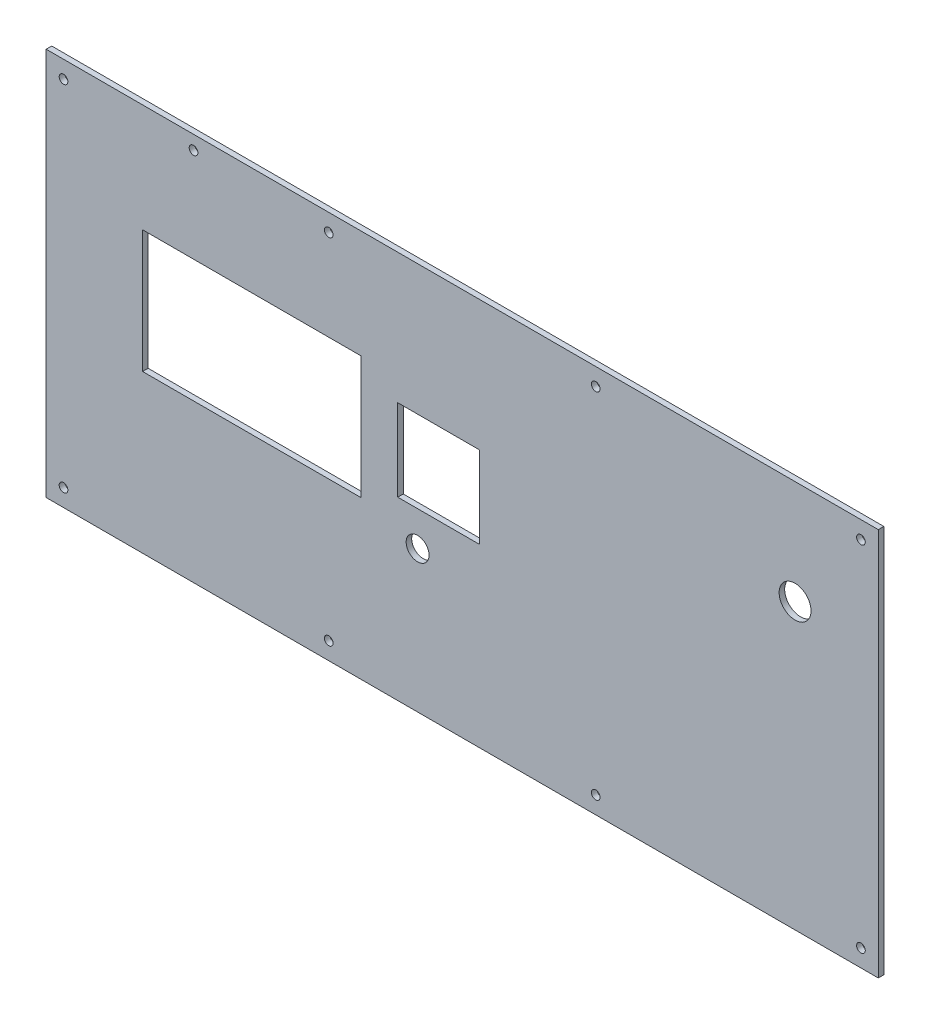
ISO-10303-21;
HEADER;
FILE_DESCRIPTION(('STEP AP214'),'2;1');
FILE_NAME('part.step','',(''),(''),'','','');
FILE_SCHEMA(('AUTOMOTIVE_DESIGN { 1 0 10303 214 1 1 1 1 }'));
ENDSEC;
DATA;
#1=APPLICATION_CONTEXT('core data for automotive mechanical design processes');
#2=APPLICATION_PROTOCOL_DEFINITION('international standard','automotive_design',2000,#1);
#3=PRODUCT_CONTEXT('',#1,'mechanical');
#4=PRODUCT('Part','Part','',(#3));
#5=PRODUCT_RELATED_PRODUCT_CATEGORY('part','',(#4));
#6=PRODUCT_DEFINITION_FORMATION('','',#4);
#7=PRODUCT_DEFINITION_CONTEXT('part definition',#1,'design');
#8=PRODUCT_DEFINITION('design','',#6,#7);
#9=PRODUCT_DEFINITION_SHAPE('','',#8);
#10=(LENGTH_UNIT() NAMED_UNIT(*) SI_UNIT(.MILLI.,.METRE.));
#11=(NAMED_UNIT(*) PLANE_ANGLE_UNIT() SI_UNIT($,.RADIAN.));
#12=(NAMED_UNIT(*) SI_UNIT($,.STERADIAN.) SOLID_ANGLE_UNIT());
#13=UNCERTAINTY_MEASURE_WITH_UNIT(LENGTH_MEASURE(1.E-05),#10,'distance_accuracy_value','');
#14=(GEOMETRIC_REPRESENTATION_CONTEXT(3) GLOBAL_UNCERTAINTY_ASSIGNED_CONTEXT((#13)) GLOBAL_UNIT_ASSIGNED_CONTEXT((#10,
#11,#12)) REPRESENTATION_CONTEXT('',''));
#15=CARTESIAN_POINT('',(0.,0.,0.));
#16=DIRECTION('',(0.,0.,1.));
#17=DIRECTION('',(1.,0.,0.));
#18=AXIS2_PLACEMENT_3D('',#15,#16,#17);
#19=CARTESIAN_POINT('',(-97.155,142.24,2.032));
#20=DIRECTION('',(1.,0.,0.));
#21=DIRECTION('',(0.,1.,0.));
#22=AXIS2_PLACEMENT_3D('',#19,#20,#21);
#23=PLANE('',#22);
#24=DIRECTION('',(0.,-1.,0.));
#25=VECTOR('',#24,1.);
#26=CARTESIAN_POINT('',(-97.155,142.24,0.));
#27=LINE('',#26,#25);
#28=CARTESIAN_POINT('',(-97.155,142.24,0.));
#29=VERTEX_POINT('',#28);
#30=CARTESIAN_POINT('',(-97.155,0.,0.));
#31=VERTEX_POINT('',#30);
#32=EDGE_CURVE('E239',#29,#31,#27,.T.);
#33=ORIENTED_EDGE('',*,*,#32,.T.);
#34=DIRECTION('',(0.,0.,-1.));
#35=VECTOR('',#34,1.);
#36=CARTESIAN_POINT('',(-97.155,0.,2.032));
#37=LINE('',#36,#35);
#38=CARTESIAN_POINT('',(-97.155,0.,2.032));
#39=VERTEX_POINT('',#38);
#40=EDGE_CURVE('E11',#39,#31,#37,.T.);
#41=ORIENTED_EDGE('',*,*,#40,.F.);
#42=DIRECTION('',(0.,-1.,0.));
#43=VECTOR('',#42,1.);
#44=CARTESIAN_POINT('',(-97.155,142.24,2.032));
#45=LINE('',#44,#43);
#46=CARTESIAN_POINT('',(-97.155,142.24,2.032));
#47=VERTEX_POINT('',#46);
#48=EDGE_CURVE('E242',#47,#39,#45,.T.);
#49=ORIENTED_EDGE('',*,*,#48,.F.);
#50=DIRECTION('',(0.,0.,-1.));
#51=VECTOR('',#50,1.);
#52=CARTESIAN_POINT('',(-97.155,142.24,2.032));
#53=LINE('',#52,#51);
#54=EDGE_CURVE('E252',#47,#29,#53,.T.);
#55=ORIENTED_EDGE('',*,*,#54,.T.);
#56=EDGE_LOOP('',(#33,#41,#49,#55));
#57=FACE_BOUND('',#56,.T.);
#58=ADVANCED_FACE('F33',(#57),#23,.F.);
#59=CARTESIAN_POINT('',(-97.155,0.,2.032));
#60=DIRECTION('',(0.,1.,0.));
#61=DIRECTION('',(0.,0.,1.));
#62=AXIS2_PLACEMENT_3D('',#59,#60,#61);
#63=PLANE('',#62);
#64=DIRECTION('',(1.,0.,0.));
#65=VECTOR('',#64,1.);
#66=CARTESIAN_POINT('',(-97.155,0.,0.));
#67=LINE('',#66,#65);
#68=CARTESIAN_POINT('',(207.645,0.,0.));
#69=VERTEX_POINT('',#68);
#70=EDGE_CURVE('E255',#31,#69,#67,.T.);
#71=ORIENTED_EDGE('',*,*,#70,.T.);
#72=DIRECTION('',(0.,0.,-1.));
#73=VECTOR('',#72,1.);
#74=CARTESIAN_POINT('',(207.645,0.,2.032));
#75=LINE('',#74,#73);
#76=CARTESIAN_POINT('',(207.645,0.,2.032));
#77=VERTEX_POINT('',#76);
#78=EDGE_CURVE('E40',#77,#69,#75,.T.);
#79=ORIENTED_EDGE('',*,*,#78,.F.);
#80=DIRECTION('',(1.,0.,0.));
#81=VECTOR('',#80,1.);
#82=CARTESIAN_POINT('',(-97.155,0.,2.032));
#83=LINE('',#82,#81);
#84=EDGE_CURVE('E245',#39,#77,#83,.T.);
#85=ORIENTED_EDGE('',*,*,#84,.F.);
#86=ORIENTED_EDGE('',*,*,#40,.T.);
#87=EDGE_LOOP('',(#71,#79,#85,#86));
#88=FACE_BOUND('',#87,.T.);
#89=ADVANCED_FACE('F284',(#88),#63,.F.);
#90=CARTESIAN_POINT('',(207.645,142.24,2.032));
#91=DIRECTION('',(-1.,0.,0.));
#92=DIRECTION('',(0.,-1.,0.));
#93=AXIS2_PLACEMENT_3D('',#90,#91,#92);
#94=PLANE('',#93);
#95=DIRECTION('',(0.,1.,0.));
#96=VECTOR('',#95,1.);
#97=CARTESIAN_POINT('',(207.645,142.24,0.));
#98=LINE('',#97,#96);
#99=CARTESIAN_POINT('',(207.645,142.24,0.));
#100=VERTEX_POINT('',#99);
#101=EDGE_CURVE('E257',#69,#100,#98,.T.);
#102=ORIENTED_EDGE('',*,*,#101,.T.);
#103=DIRECTION('',(0.,0.,-1.));
#104=VECTOR('',#103,1.);
#105=CARTESIAN_POINT('',(207.645,142.24,2.032));
#106=LINE('',#105,#104);
#107=CARTESIAN_POINT('',(207.645,142.24,2.032));
#108=VERTEX_POINT('',#107);
#109=EDGE_CURVE('E262',#108,#100,#106,.T.);
#110=ORIENTED_EDGE('',*,*,#109,.F.);
#111=DIRECTION('',(0.,1.,0.));
#112=VECTOR('',#111,1.);
#113=CARTESIAN_POINT('',(207.645,142.24,2.032));
#114=LINE('',#113,#112);
#115=EDGE_CURVE('E248',#77,#108,#114,.T.);
#116=ORIENTED_EDGE('',*,*,#115,.F.);
#117=ORIENTED_EDGE('',*,*,#78,.T.);
#118=EDGE_LOOP('',(#102,#110,#116,#117));
#119=FACE_BOUND('',#118,.T.);
#120=ADVANCED_FACE('F269',(#119),#94,.F.);
#121=CARTESIAN_POINT('',(-97.155,142.24,2.032));
#122=DIRECTION('',(0.,-1.,0.));
#123=DIRECTION('',(0.,0.,-1.));
#124=AXIS2_PLACEMENT_3D('',#121,#122,#123);
#125=PLANE('',#124);
#126=DIRECTION('',(-1.,0.,0.));
#127=VECTOR('',#126,1.);
#128=CARTESIAN_POINT('',(-97.155,142.24,0.));
#129=LINE('',#128,#127);
#130=EDGE_CURVE('E246',#100,#29,#129,.T.);
#131=ORIENTED_EDGE('',*,*,#130,.T.);
#132=ORIENTED_EDGE('',*,*,#54,.F.);
#133=DIRECTION('',(-1.,0.,0.));
#134=VECTOR('',#133,1.);
#135=CARTESIAN_POINT('',(-97.155,142.24,2.032));
#136=LINE('',#135,#134);
#137=EDGE_CURVE('E250',#108,#47,#136,.T.);
#138=ORIENTED_EDGE('',*,*,#137,.F.);
#139=ORIENTED_EDGE('',*,*,#109,.T.);
#140=EDGE_LOOP('',(#131,#132,#138,#139));
#141=FACE_BOUND('',#140,.T.);
#142=ADVANCED_FACE('F277',(#141),#125,.F.);
#143=CARTESIAN_POINT('',(-97.155,0.,2.032));
#144=DIRECTION('',(0.,0.,1.));
#145=DIRECTION('',(1.,0.,0.));
#146=AXIS2_PLACEMENT_3D('',#143,#144,#145);
#147=PLANE('',#146);
#148=CARTESIAN_POINT('',(177.165,104.14,2.032));
#149=DIRECTION('',(0.,0.,1.));
#150=DIRECTION('',(1.,0.,0.));
#151=AXIS2_PLACEMENT_3D('',#148,#149,#150);
#152=CIRCLE('',#151,5.84199999999999);
#153=CARTESIAN_POINT('',(183.007,104.14,2.032));
#154=VERTEX_POINT('',#153);
#155=EDGE_CURVE('E378',#154,#154,#152,.T.);
#156=ORIENTED_EDGE('',*,*,#155,.F.);
#157=EDGE_LOOP('',(#156));
#158=FACE_BOUND('',#157,.T.);
#159=CARTESIAN_POINT('',(38.895,51.84,2.032));
#160=DIRECTION('',(0.,0.,1.));
#161=DIRECTION('',(1.,0.,0.));
#162=AXIS2_PLACEMENT_3D('',#159,#160,#161);
#163=CIRCLE('',#162,4.191);
#164=CARTESIAN_POINT('',(43.086,51.84,2.032));
#165=VERTEX_POINT('',#164);
#166=EDGE_CURVE('E380',#165,#165,#163,.T.);
#167=ORIENTED_EDGE('',*,*,#166,.F.);
#168=EDGE_LOOP('',(#167));
#169=FACE_BOUND('',#168,.T.);
#170=CARTESIAN_POINT('',(-43.18,137.16,2.032));
#171=DIRECTION('',(0.,0.,1.));
#172=DIRECTION('',(1.,0.,0.));
#173=AXIS2_PLACEMENT_3D('',#170,#171,#172);
#174=CIRCLE('',#173,1.5875);
#175=CARTESIAN_POINT('',(-41.5925,137.16,2.032));
#176=VERTEX_POINT('',#175);
#177=EDGE_CURVE('E145',#176,#176,#174,.T.);
#178=ORIENTED_EDGE('',*,*,#177,.F.);
#179=EDGE_LOOP('',(#178));
#180=FACE_BOUND('',#179,.T.);
#181=DIRECTION('',(0.,-1.,0.));
#182=VECTOR('',#181,1.);
#183=CARTESIAN_POINT('',(-61.849,102.616,2.032));
#184=LINE('',#183,#182);
#185=CARTESIAN_POINT('',(-61.849,102.616,2.032));
#186=VERTEX_POINT('',#185);
#187=CARTESIAN_POINT('',(-61.849,57.658,2.032));
#188=VERTEX_POINT('',#187);
#189=EDGE_CURVE('E47',#186,#188,#184,.T.);
#190=ORIENTED_EDGE('',*,*,#189,.F.);
#191=DIRECTION('',(-1.,0.,0.));
#192=VECTOR('',#191,1.);
#193=CARTESIAN_POINT('',(-61.849,102.616,2.032));
#194=LINE('',#193,#192);
#195=CARTESIAN_POINT('',(18.1609999999999,102.616,2.032));
#196=VERTEX_POINT('',#195);
#197=EDGE_CURVE('E139',#196,#186,#194,.T.);
#198=ORIENTED_EDGE('',*,*,#197,.F.);
#199=DIRECTION('',(0.,1.,0.));
#200=VECTOR('',#199,1.);
#201=CARTESIAN_POINT('',(18.1609999999999,102.616,2.032));
#202=LINE('',#201,#200);
#203=CARTESIAN_POINT('',(18.1609999999999,57.658,2.032));
#204=VERTEX_POINT('',#203);
#205=EDGE_CURVE('E142',#204,#196,#202,.T.);
#206=ORIENTED_EDGE('',*,*,#205,.F.);
#207=DIRECTION('',(1.,0.,0.));
#208=VECTOR('',#207,1.);
#209=CARTESIAN_POINT('',(-61.849,57.658,2.032));
#210=LINE('',#209,#208);
#211=EDGE_CURVE('E151',#188,#204,#210,.T.);
#212=ORIENTED_EDGE('',*,*,#211,.F.);
#213=EDGE_LOOP('',(#190,#198,#206,#212));
#214=FACE_BOUND('',#213,.T.);
#215=DIRECTION('',(0.,-1.,0.));
#216=VECTOR('',#215,1.);
#217=CARTESIAN_POINT('',(31.623,64.516,2.032));
#218=LINE('',#217,#216);
#219=CARTESIAN_POINT('',(31.623,94.488,2.032));
#220=VERTEX_POINT('',#219);
#221=CARTESIAN_POINT('',(31.623,64.516,2.032));
#222=VERTEX_POINT('',#221);
#223=EDGE_CURVE('E158',#220,#222,#218,.T.);
#224=ORIENTED_EDGE('',*,*,#223,.F.);
#225=DIRECTION('',(-1.,0.,0.));
#226=VECTOR('',#225,1.);
#227=CARTESIAN_POINT('',(31.623,94.488,2.032));
#228=LINE('',#227,#226);
#229=CARTESIAN_POINT('',(61.5949999999999,94.488,2.032));
#230=VERTEX_POINT('',#229);
#231=EDGE_CURVE('E166',#230,#220,#228,.T.);
#232=ORIENTED_EDGE('',*,*,#231,.F.);
#233=DIRECTION('',(0.,1.,0.));
#234=VECTOR('',#233,1.);
#235=CARTESIAN_POINT('',(61.595,64.516,2.032));
#236=LINE('',#235,#234);
#237=CARTESIAN_POINT('',(61.595,64.516,2.032));
#238=VERTEX_POINT('',#237);
#239=EDGE_CURVE('E180',#238,#230,#236,.T.);
#240=ORIENTED_EDGE('',*,*,#239,.F.);
#241=DIRECTION('',(1.,0.,0.));
#242=VECTOR('',#241,1.);
#243=CARTESIAN_POINT('',(31.623,64.516,2.032));
#244=LINE('',#243,#242);
#245=EDGE_CURVE('E177',#222,#238,#244,.T.);
#246=ORIENTED_EDGE('',*,*,#245,.F.);
#247=EDGE_LOOP('',(#224,#232,#240,#246));
#248=FACE_BOUND('',#247,.T.);
#249=CARTESIAN_POINT('',(201.295,135.89,2.032));
#250=DIRECTION('',(0.,0.,1.));
#251=DIRECTION('',(-1.,0.,0.));
#252=AXIS2_PLACEMENT_3D('',#249,#250,#251);
#253=CIRCLE('',#252,1.58750000000001);
#254=CARTESIAN_POINT('',(199.7075,135.89,2.032));
#255=VERTEX_POINT('',#254);
#256=EDGE_CURVE('E187',#255,#255,#253,.T.);
#257=ORIENTED_EDGE('',*,*,#256,.F.);
#258=EDGE_LOOP('',(#257));
#259=FACE_BOUND('',#258,.T.);
#260=CARTESIAN_POINT('',(201.295,6.35,2.032));
#261=DIRECTION('',(0.,0.,1.));
#262=DIRECTION('',(-1.,0.,0.));
#263=AXIS2_PLACEMENT_3D('',#260,#261,#262);
#264=CIRCLE('',#263,1.58750000000001);
#265=CARTESIAN_POINT('',(199.7075,6.35,2.032));
#266=VERTEX_POINT('',#265);
#267=EDGE_CURVE('E197',#266,#266,#264,.T.);
#268=ORIENTED_EDGE('',*,*,#267,.F.);
#269=EDGE_LOOP('',(#268));
#270=FACE_BOUND('',#269,.T.);
#271=CARTESIAN_POINT('',(104.14,135.89,2.032));
#272=DIRECTION('',(0.,0.,1.));
#273=DIRECTION('',(-1.,0.,0.));
#274=AXIS2_PLACEMENT_3D('',#271,#272,#273);
#275=CIRCLE('',#274,1.58749999999999);
#276=CARTESIAN_POINT('',(102.5525,135.89,2.032));
#277=VERTEX_POINT('',#276);
#278=EDGE_CURVE('E203',#277,#277,#275,.T.);
#279=ORIENTED_EDGE('',*,*,#278,.F.);
#280=EDGE_LOOP('',(#279));
#281=FACE_BOUND('',#280,.T.);
#282=CARTESIAN_POINT('',(104.14,6.34999999999882,2.032));
#283=DIRECTION('',(0.,0.,1.));
#284=DIRECTION('',(-1.,0.,0.));
#285=AXIS2_PLACEMENT_3D('',#282,#283,#284);
#286=CIRCLE('',#285,1.5875);
#287=CARTESIAN_POINT('',(102.5525,6.34999999999882,2.032));
#288=VERTEX_POINT('',#287);
#289=EDGE_CURVE('E209',#288,#288,#286,.T.);
#290=ORIENTED_EDGE('',*,*,#289,.F.);
#291=EDGE_LOOP('',(#290));
#292=FACE_BOUND('',#291,.T.);
#293=CARTESIAN_POINT('',(6.35,6.34999999999882,2.032));
#294=DIRECTION('',(0.,0.,1.));
#295=DIRECTION('',(1.,0.,0.));
#296=AXIS2_PLACEMENT_3D('',#293,#294,#295);
#297=CIRCLE('',#296,1.5875);
#298=CARTESIAN_POINT('',(7.9375,6.34999999999882,2.032));
#299=VERTEX_POINT('',#298);
#300=EDGE_CURVE('E215',#299,#299,#297,.T.);
#301=ORIENTED_EDGE('',*,*,#300,.F.);
#302=EDGE_LOOP('',(#301));
#303=FACE_BOUND('',#302,.T.);
#304=CARTESIAN_POINT('',(6.34999999999999,135.89,2.032));
#305=DIRECTION('',(0.,0.,1.));
#306=DIRECTION('',(1.,0.,0.));
#307=AXIS2_PLACEMENT_3D('',#304,#305,#306);
#308=CIRCLE('',#307,1.5875);
#309=CARTESIAN_POINT('',(7.93749999999999,135.89,2.032));
#310=VERTEX_POINT('',#309);
#311=EDGE_CURVE('E221',#310,#310,#308,.T.);
#312=ORIENTED_EDGE('',*,*,#311,.F.);
#313=EDGE_LOOP('',(#312));
#314=FACE_BOUND('',#313,.T.);
#315=CARTESIAN_POINT('',(-90.805,6.35,2.032));
#316=DIRECTION('',(0.,0.,1.));
#317=DIRECTION('',(1.,0.,0.));
#318=AXIS2_PLACEMENT_3D('',#315,#316,#317);
#319=CIRCLE('',#318,1.5875);
#320=CARTESIAN_POINT('',(-89.2175,6.35,2.032));
#321=VERTEX_POINT('',#320);
#322=EDGE_CURVE('E227',#321,#321,#319,.T.);
#323=ORIENTED_EDGE('',*,*,#322,.F.);
#324=EDGE_LOOP('',(#323));
#325=FACE_BOUND('',#324,.T.);
#326=CARTESIAN_POINT('',(-90.805,135.89,2.032));
#327=DIRECTION('',(0.,0.,1.));
#328=DIRECTION('',(1.,0.,0.));
#329=AXIS2_PLACEMENT_3D('',#326,#327,#328);
#330=CIRCLE('',#329,1.58749999999999);
#331=CARTESIAN_POINT('',(-89.2175000000001,135.89,2.032));
#332=VERTEX_POINT('',#331);
#333=EDGE_CURVE('E233',#332,#332,#330,.T.);
#334=ORIENTED_EDGE('',*,*,#333,.F.);
#335=EDGE_LOOP('',(#334));
#336=FACE_BOUND('',#335,.T.);
#337=ORIENTED_EDGE('',*,*,#48,.T.);
#338=ORIENTED_EDGE('',*,*,#84,.T.);
#339=ORIENTED_EDGE('',*,*,#115,.T.);
#340=ORIENTED_EDGE('',*,*,#137,.T.);
#341=EDGE_LOOP('',(#337,#338,#339,#340));
#342=FACE_BOUND('',#341,.T.);
#343=ADVANCED_FACE('F283',(#158,#169,#180,#214,#248,#259,#270,#281,#292,#303,#314,#325,#336,
#342),#147,.T.);
#344=CARTESIAN_POINT('',(-97.155,0.,0.));
#345=DIRECTION('',(0.,0.,1.));
#346=DIRECTION('',(1.,0.,0.));
#347=AXIS2_PLACEMENT_3D('',#344,#345,#346);
#348=PLANE('',#347);
#349=CARTESIAN_POINT('',(177.165,104.14,0.));
#350=DIRECTION('',(0.,0.,1.));
#351=DIRECTION('',(1.,0.,0.));
#352=AXIS2_PLACEMENT_3D('',#349,#350,#351);
#353=CIRCLE('',#352,5.84199999999999);
#354=CARTESIAN_POINT('',(183.007,104.14,0.));
#355=VERTEX_POINT('',#354);
#356=EDGE_CURVE('E375',#355,#355,#353,.T.);
#357=ORIENTED_EDGE('',*,*,#356,.T.);
#358=EDGE_LOOP('',(#357));
#359=FACE_BOUND('',#358,.T.);
#360=CARTESIAN_POINT('',(38.895,51.84,0.));
#361=DIRECTION('',(0.,0.,1.));
#362=DIRECTION('',(1.,0.,0.));
#363=AXIS2_PLACEMENT_3D('',#360,#361,#362);
#364=CIRCLE('',#363,4.191);
#365=CARTESIAN_POINT('',(43.086,51.84,0.));
#366=VERTEX_POINT('',#365);
#367=EDGE_CURVE('E383',#366,#366,#364,.T.);
#368=ORIENTED_EDGE('',*,*,#367,.T.);
#369=EDGE_LOOP('',(#368));
#370=FACE_BOUND('',#369,.T.);
#371=CARTESIAN_POINT('',(-43.18,137.16,0.));
#372=DIRECTION('',(0.,0.,1.));
#373=DIRECTION('',(1.,0.,0.));
#374=AXIS2_PLACEMENT_3D('',#371,#372,#373);
#375=CIRCLE('',#374,1.5875);
#376=CARTESIAN_POINT('',(-41.5925,137.16,0.));
#377=VERTEX_POINT('',#376);
#378=EDGE_CURVE('E152',#377,#377,#375,.T.);
#379=ORIENTED_EDGE('',*,*,#378,.T.);
#380=EDGE_LOOP('',(#379));
#381=FACE_BOUND('',#380,.T.);
#382=DIRECTION('',(-1.,0.,0.));
#383=VECTOR('',#382,1.);
#384=CARTESIAN_POINT('',(-61.849,102.616,0.));
#385=LINE('',#384,#383);
#386=CARTESIAN_POINT('',(18.1609999999999,102.616,0.));
#387=VERTEX_POINT('',#386);
#388=CARTESIAN_POINT('',(-61.849,102.616,0.));
#389=VERTEX_POINT('',#388);
#390=EDGE_CURVE('E129',#387,#389,#385,.T.);
#391=ORIENTED_EDGE('',*,*,#390,.T.);
#392=DIRECTION('',(0.,-1.,0.));
#393=VECTOR('',#392,1.);
#394=CARTESIAN_POINT('',(-61.849,102.616,0.));
#395=LINE('',#394,#393);
#396=CARTESIAN_POINT('',(-61.849,57.658,0.));
#397=VERTEX_POINT('',#396);
#398=EDGE_CURVE('E123',#389,#397,#395,.T.);
#399=ORIENTED_EDGE('',*,*,#398,.T.);
#400=DIRECTION('',(1.,0.,0.));
#401=VECTOR('',#400,1.);
#402=CARTESIAN_POINT('',(-61.849,57.658,0.));
#403=LINE('',#402,#401);
#404=CARTESIAN_POINT('',(18.1609999999999,57.658,0.));
#405=VERTEX_POINT('',#404);
#406=EDGE_CURVE('E132',#397,#405,#403,.T.);
#407=ORIENTED_EDGE('',*,*,#406,.T.);
#408=DIRECTION('',(0.,1.,0.));
#409=VECTOR('',#408,1.);
#410=CARTESIAN_POINT('',(18.1609999999999,102.616,0.));
#411=LINE('',#410,#409);
#412=EDGE_CURVE('E55',#405,#387,#411,.T.);
#413=ORIENTED_EDGE('',*,*,#412,.T.);
#414=EDGE_LOOP('',(#391,#399,#407,#413));
#415=FACE_BOUND('',#414,.T.);
#416=DIRECTION('',(-1.,0.,0.));
#417=VECTOR('',#416,1.);
#418=CARTESIAN_POINT('',(31.623,94.488,0.));
#419=LINE('',#418,#417);
#420=CARTESIAN_POINT('',(61.5949999999999,94.488,0.));
#421=VERTEX_POINT('',#420);
#422=CARTESIAN_POINT('',(31.623,94.488,0.));
#423=VERTEX_POINT('',#422);
#424=EDGE_CURVE('E172',#421,#423,#419,.T.);
#425=ORIENTED_EDGE('',*,*,#424,.T.);
#426=DIRECTION('',(0.,-1.,0.));
#427=VECTOR('',#426,1.);
#428=CARTESIAN_POINT('',(31.623,64.516,0.));
#429=LINE('',#428,#427);
#430=CARTESIAN_POINT('',(31.623,64.516,0.));
#431=VERTEX_POINT('',#430);
#432=EDGE_CURVE('E162',#423,#431,#429,.T.);
#433=ORIENTED_EDGE('',*,*,#432,.T.);
#434=DIRECTION('',(1.,0.,0.));
#435=VECTOR('',#434,1.);
#436=CARTESIAN_POINT('',(31.623,64.516,0.));
#437=LINE('',#436,#435);
#438=CARTESIAN_POINT('',(61.5949999999999,64.516,0.));
#439=VERTEX_POINT('',#438);
#440=EDGE_CURVE('E165',#431,#439,#437,.T.);
#441=ORIENTED_EDGE('',*,*,#440,.T.);
#442=DIRECTION('',(0.,1.,0.));
#443=VECTOR('',#442,1.);
#444=CARTESIAN_POINT('',(61.595,64.516,0.));
#445=LINE('',#444,#443);
#446=EDGE_CURVE('E169',#439,#421,#445,.T.);
#447=ORIENTED_EDGE('',*,*,#446,.T.);
#448=EDGE_LOOP('',(#425,#433,#441,#447));
#449=FACE_BOUND('',#448,.T.);
#450=CARTESIAN_POINT('',(201.295,135.89,0.));
#451=DIRECTION('',(0.,0.,1.));
#452=DIRECTION('',(-1.,0.,0.));
#453=AXIS2_PLACEMENT_3D('',#450,#451,#452);
#454=CIRCLE('',#453,1.58750000000001);
#455=CARTESIAN_POINT('',(199.7075,135.89,0.));
#456=VERTEX_POINT('',#455);
#457=EDGE_CURVE('E194',#456,#456,#454,.T.);
#458=ORIENTED_EDGE('',*,*,#457,.T.);
#459=EDGE_LOOP('',(#458));
#460=FACE_BOUND('',#459,.T.);
#461=CARTESIAN_POINT('',(201.295,6.35,0.));
#462=DIRECTION('',(0.,0.,1.));
#463=DIRECTION('',(-1.,0.,0.));
#464=AXIS2_PLACEMENT_3D('',#461,#462,#463);
#465=CIRCLE('',#464,1.58750000000001);
#466=CARTESIAN_POINT('',(199.7075,6.35,0.));
#467=VERTEX_POINT('',#466);
#468=EDGE_CURVE('E200',#467,#467,#465,.T.);
#469=ORIENTED_EDGE('',*,*,#468,.T.);
#470=EDGE_LOOP('',(#469));
#471=FACE_BOUND('',#470,.T.);
#472=CARTESIAN_POINT('',(104.14,135.89,0.));
#473=DIRECTION('',(0.,0.,1.));
#474=DIRECTION('',(-1.,0.,0.));
#475=AXIS2_PLACEMENT_3D('',#472,#473,#474);
#476=CIRCLE('',#475,1.58749999999999);
#477=CARTESIAN_POINT('',(102.5525,135.89,0.));
#478=VERTEX_POINT('',#477);
#479=EDGE_CURVE('E206',#478,#478,#476,.T.);
#480=ORIENTED_EDGE('',*,*,#479,.T.);
#481=EDGE_LOOP('',(#480));
#482=FACE_BOUND('',#481,.T.);
#483=CARTESIAN_POINT('',(104.14,6.34999999999882,0.));
#484=DIRECTION('',(0.,0.,1.));
#485=DIRECTION('',(-1.,0.,0.));
#486=AXIS2_PLACEMENT_3D('',#483,#484,#485);
#487=CIRCLE('',#486,1.5875);
#488=CARTESIAN_POINT('',(102.5525,6.34999999999882,0.));
#489=VERTEX_POINT('',#488);
#490=EDGE_CURVE('E212',#489,#489,#487,.T.);
#491=ORIENTED_EDGE('',*,*,#490,.T.);
#492=EDGE_LOOP('',(#491));
#493=FACE_BOUND('',#492,.T.);
#494=CARTESIAN_POINT('',(6.35,6.34999999999882,0.));
#495=DIRECTION('',(0.,0.,1.));
#496=DIRECTION('',(1.,0.,0.));
#497=AXIS2_PLACEMENT_3D('',#494,#495,#496);
#498=CIRCLE('',#497,1.5875);
#499=CARTESIAN_POINT('',(7.9375,6.34999999999882,0.));
#500=VERTEX_POINT('',#499);
#501=EDGE_CURVE('E218',#500,#500,#498,.T.);
#502=ORIENTED_EDGE('',*,*,#501,.T.);
#503=EDGE_LOOP('',(#502));
#504=FACE_BOUND('',#503,.T.);
#505=CARTESIAN_POINT('',(6.34999999999999,135.89,0.));
#506=DIRECTION('',(0.,0.,1.));
#507=DIRECTION('',(1.,0.,0.));
#508=AXIS2_PLACEMENT_3D('',#505,#506,#507);
#509=CIRCLE('',#508,1.5875);
#510=CARTESIAN_POINT('',(7.93749999999999,135.89,0.));
#511=VERTEX_POINT('',#510);
#512=EDGE_CURVE('E224',#511,#511,#509,.T.);
#513=ORIENTED_EDGE('',*,*,#512,.T.);
#514=EDGE_LOOP('',(#513));
#515=FACE_BOUND('',#514,.T.);
#516=CARTESIAN_POINT('',(-90.805,6.35,0.));
#517=DIRECTION('',(0.,0.,1.));
#518=DIRECTION('',(1.,0.,0.));
#519=AXIS2_PLACEMENT_3D('',#516,#517,#518);
#520=CIRCLE('',#519,1.5875);
#521=CARTESIAN_POINT('',(-89.2175,6.35,0.));
#522=VERTEX_POINT('',#521);
#523=EDGE_CURVE('E230',#522,#522,#520,.T.);
#524=ORIENTED_EDGE('',*,*,#523,.T.);
#525=EDGE_LOOP('',(#524));
#526=FACE_BOUND('',#525,.T.);
#527=CARTESIAN_POINT('',(-90.805,135.89,0.));
#528=DIRECTION('',(0.,0.,1.));
#529=DIRECTION('',(1.,0.,0.));
#530=AXIS2_PLACEMENT_3D('',#527,#528,#529);
#531=CIRCLE('',#530,1.58749999999999);
#532=CARTESIAN_POINT('',(-89.2175000000001,135.89,0.));
#533=VERTEX_POINT('',#532);
#534=EDGE_CURVE('E236',#533,#533,#531,.T.);
#535=ORIENTED_EDGE('',*,*,#534,.T.);
#536=EDGE_LOOP('',(#535));
#537=FACE_BOUND('',#536,.T.);
#538=ORIENTED_EDGE('',*,*,#32,.F.);
#539=ORIENTED_EDGE('',*,*,#130,.F.);
#540=ORIENTED_EDGE('',*,*,#101,.F.);
#541=ORIENTED_EDGE('',*,*,#70,.F.);
#542=EDGE_LOOP('',(#538,#539,#540,#541));
#543=FACE_BOUND('',#542,.T.);
#544=ADVANCED_FACE('F136',(#359,#370,#381,#415,#449,#460,#471,#482,#493,#504,#515,#526,#537,
#543),#348,.F.);
#545=CARTESIAN_POINT('',(-90.805,135.89,0.));
#546=DIRECTION('',(0.,0.,1.));
#547=DIRECTION('',(1.,0.,0.));
#548=AXIS2_PLACEMENT_3D('',#545,#546,#547);
#549=CYLINDRICAL_SURFACE('',#548,1.58749999999999);
#550=ORIENTED_EDGE('',*,*,#534,.F.);
#551=EDGE_LOOP('',(#550));
#552=FACE_BOUND('',#551,.T.);
#553=ORIENTED_EDGE('',*,*,#333,.T.);
#554=EDGE_LOOP('',(#553));
#555=FACE_BOUND('',#554,.T.);
#556=ADVANCED_FACE('F296',(#552,#555),#549,.F.);
#557=CARTESIAN_POINT('',(-90.805,6.35,0.));
#558=DIRECTION('',(0.,0.,1.));
#559=DIRECTION('',(1.,0.,0.));
#560=AXIS2_PLACEMENT_3D('',#557,#558,#559);
#561=CYLINDRICAL_SURFACE('',#560,1.5875);
#562=ORIENTED_EDGE('',*,*,#523,.F.);
#563=EDGE_LOOP('',(#562));
#564=FACE_BOUND('',#563,.T.);
#565=ORIENTED_EDGE('',*,*,#322,.T.);
#566=EDGE_LOOP('',(#565));
#567=FACE_BOUND('',#566,.T.);
#568=ADVANCED_FACE('F303',(#564,#567),#561,.F.);
#569=CARTESIAN_POINT('',(6.34999999999999,135.89,0.));
#570=DIRECTION('',(0.,0.,1.));
#571=DIRECTION('',(1.,0.,0.));
#572=AXIS2_PLACEMENT_3D('',#569,#570,#571);
#573=CYLINDRICAL_SURFACE('',#572,1.5875);
#574=ORIENTED_EDGE('',*,*,#512,.F.);
#575=EDGE_LOOP('',(#574));
#576=FACE_BOUND('',#575,.T.);
#577=ORIENTED_EDGE('',*,*,#311,.T.);
#578=EDGE_LOOP('',(#577));
#579=FACE_BOUND('',#578,.T.);
#580=ADVANCED_FACE('F307',(#576,#579),#573,.F.);
#581=CARTESIAN_POINT('',(6.35,6.34999999999882,0.));
#582=DIRECTION('',(0.,0.,1.));
#583=DIRECTION('',(1.,0.,0.));
#584=AXIS2_PLACEMENT_3D('',#581,#582,#583);
#585=CYLINDRICAL_SURFACE('',#584,1.5875);
#586=ORIENTED_EDGE('',*,*,#501,.F.);
#587=EDGE_LOOP('',(#586));
#588=FACE_BOUND('',#587,.T.);
#589=ORIENTED_EDGE('',*,*,#300,.T.);
#590=EDGE_LOOP('',(#589));
#591=FACE_BOUND('',#590,.T.);
#592=ADVANCED_FACE('F311',(#588,#591),#585,.F.);
#593=CARTESIAN_POINT('',(104.14,6.34999999999882,0.));
#594=DIRECTION('',(0.,0.,1.));
#595=DIRECTION('',(1.,0.,0.));
#596=AXIS2_PLACEMENT_3D('',#593,#594,#595);
#597=CYLINDRICAL_SURFACE('',#596,1.5875);
#598=ORIENTED_EDGE('',*,*,#490,.F.);
#599=EDGE_LOOP('',(#598));
#600=FACE_BOUND('',#599,.T.);
#601=ORIENTED_EDGE('',*,*,#289,.T.);
#602=EDGE_LOOP('',(#601));
#603=FACE_BOUND('',#602,.T.);
#604=ADVANCED_FACE('F315',(#600,#603),#597,.F.);
#605=CARTESIAN_POINT('',(104.14,135.89,0.));
#606=DIRECTION('',(0.,0.,1.));
#607=DIRECTION('',(1.,0.,0.));
#608=AXIS2_PLACEMENT_3D('',#605,#606,#607);
#609=CYLINDRICAL_SURFACE('',#608,1.58749999999999);
#610=ORIENTED_EDGE('',*,*,#479,.F.);
#611=EDGE_LOOP('',(#610));
#612=FACE_BOUND('',#611,.T.);
#613=ORIENTED_EDGE('',*,*,#278,.T.);
#614=EDGE_LOOP('',(#613));
#615=FACE_BOUND('',#614,.T.);
#616=ADVANCED_FACE('F319',(#612,#615),#609,.F.);
#617=CARTESIAN_POINT('',(201.295,6.35,0.));
#618=DIRECTION('',(0.,0.,1.));
#619=DIRECTION('',(1.,0.,0.));
#620=AXIS2_PLACEMENT_3D('',#617,#618,#619);
#621=CYLINDRICAL_SURFACE('',#620,1.58750000000001);
#622=ORIENTED_EDGE('',*,*,#468,.F.);
#623=EDGE_LOOP('',(#622));
#624=FACE_BOUND('',#623,.T.);
#625=ORIENTED_EDGE('',*,*,#267,.T.);
#626=EDGE_LOOP('',(#625));
#627=FACE_BOUND('',#626,.T.);
#628=ADVANCED_FACE('F323',(#624,#627),#621,.F.);
#629=CARTESIAN_POINT('',(201.295,135.89,0.));
#630=DIRECTION('',(0.,0.,1.));
#631=DIRECTION('',(1.,0.,0.));
#632=AXIS2_PLACEMENT_3D('',#629,#630,#631);
#633=CYLINDRICAL_SURFACE('',#632,1.58750000000001);
#634=ORIENTED_EDGE('',*,*,#457,.F.);
#635=EDGE_LOOP('',(#634));
#636=FACE_BOUND('',#635,.T.);
#637=ORIENTED_EDGE('',*,*,#256,.T.);
#638=EDGE_LOOP('',(#637));
#639=FACE_BOUND('',#638,.T.);
#640=ADVANCED_FACE('F327',(#636,#639),#633,.F.);
#641=CARTESIAN_POINT('',(31.623,64.516,0.));
#642=DIRECTION('',(-1.,0.,0.));
#643=DIRECTION('',(0.,-1.,0.));
#644=AXIS2_PLACEMENT_3D('',#641,#642,#643);
#645=PLANE('',#644);
#646=ORIENTED_EDGE('',*,*,#223,.T.);
#647=DIRECTION('',(0.,0.,1.));
#648=VECTOR('',#647,1.);
#649=CARTESIAN_POINT('',(31.623,64.516,0.));
#650=LINE('',#649,#648);
#651=EDGE_CURVE('E175',#431,#222,#650,.T.);
#652=ORIENTED_EDGE('',*,*,#651,.F.);
#653=ORIENTED_EDGE('',*,*,#432,.F.);
#654=DIRECTION('',(0.,0.,1.));
#655=VECTOR('',#654,1.);
#656=CARTESIAN_POINT('',(31.623,94.488,0.));
#657=LINE('',#656,#655);
#658=EDGE_CURVE('E185',#423,#220,#657,.T.);
#659=ORIENTED_EDGE('',*,*,#658,.T.);
#660=EDGE_LOOP('',(#646,#652,#653,#659));
#661=FACE_BOUND('',#660,.T.);
#662=ADVANCED_FACE('F331',(#661),#645,.F.);
#663=CARTESIAN_POINT('',(31.623,94.488,0.));
#664=DIRECTION('',(0.,1.,0.));
#665=DIRECTION('',(0.,0.,1.));
#666=AXIS2_PLACEMENT_3D('',#663,#664,#665);
#667=PLANE('',#666);
#668=ORIENTED_EDGE('',*,*,#231,.T.);
#669=ORIENTED_EDGE('',*,*,#658,.F.);
#670=ORIENTED_EDGE('',*,*,#424,.F.);
#671=DIRECTION('',(0.,0.,1.));
#672=VECTOR('',#671,1.);
#673=CARTESIAN_POINT('',(61.5949999999999,94.488,0.));
#674=LINE('',#673,#672);
#675=EDGE_CURVE('E188',#421,#230,#674,.T.);
#676=ORIENTED_EDGE('',*,*,#675,.T.);
#677=EDGE_LOOP('',(#668,#669,#670,#676));
#678=FACE_BOUND('',#677,.T.);
#679=ADVANCED_FACE('F335',(#678),#667,.F.);
#680=CARTESIAN_POINT('',(61.595,64.516,0.));
#681=DIRECTION('',(1.,0.,0.));
#682=DIRECTION('',(0.,1.,0.));
#683=AXIS2_PLACEMENT_3D('',#680,#681,#682);
#684=PLANE('',#683);
#685=ORIENTED_EDGE('',*,*,#239,.T.);
#686=ORIENTED_EDGE('',*,*,#675,.F.);
#687=ORIENTED_EDGE('',*,*,#446,.F.);
#688=DIRECTION('',(0.,0.,1.));
#689=VECTOR('',#688,1.);
#690=CARTESIAN_POINT('',(61.595,64.516,0.));
#691=LINE('',#690,#689);
#692=EDGE_CURVE('E190',#439,#238,#691,.T.);
#693=ORIENTED_EDGE('',*,*,#692,.T.);
#694=EDGE_LOOP('',(#685,#686,#687,#693));
#695=FACE_BOUND('',#694,.T.);
#696=ADVANCED_FACE('F340',(#695),#684,.F.);
#697=CARTESIAN_POINT('',(31.623,64.516,0.));
#698=DIRECTION('',(0.,-1.,0.));
#699=DIRECTION('',(0.,0.,-1.));
#700=AXIS2_PLACEMENT_3D('',#697,#698,#699);
#701=PLANE('',#700);
#702=ORIENTED_EDGE('',*,*,#245,.T.);
#703=ORIENTED_EDGE('',*,*,#692,.F.);
#704=ORIENTED_EDGE('',*,*,#440,.F.);
#705=ORIENTED_EDGE('',*,*,#651,.T.);
#706=EDGE_LOOP('',(#702,#703,#704,#705));
#707=FACE_BOUND('',#706,.T.);
#708=ADVANCED_FACE('F337',(#707),#701,.F.);
#709=CARTESIAN_POINT('',(-61.849,102.616,0.));
#710=DIRECTION('',(-1.,0.,0.));
#711=DIRECTION('',(0.,-1.,0.));
#712=AXIS2_PLACEMENT_3D('',#709,#710,#711);
#713=PLANE('',#712);
#714=ORIENTED_EDGE('',*,*,#189,.T.);
#715=DIRECTION('',(0.,0.,1.));
#716=VECTOR('',#715,1.);
#717=CARTESIAN_POINT('',(-61.849,57.658,0.));
#718=LINE('',#717,#716);
#719=EDGE_CURVE('E119',#397,#188,#718,.T.);
#720=ORIENTED_EDGE('',*,*,#719,.F.);
#721=ORIENTED_EDGE('',*,*,#398,.F.);
#722=DIRECTION('',(0.,0.,1.));
#723=VECTOR('',#722,1.);
#724=CARTESIAN_POINT('',(-61.849,102.616,0.));
#725=LINE('',#724,#723);
#726=EDGE_CURVE('E156',#389,#186,#725,.T.);
#727=ORIENTED_EDGE('',*,*,#726,.T.);
#728=EDGE_LOOP('',(#714,#720,#721,#727));
#729=FACE_BOUND('',#728,.T.);
#730=ADVANCED_FACE('F121',(#729),#713,.F.);
#731=CARTESIAN_POINT('',(-61.849,102.616,0.));
#732=DIRECTION('',(0.,1.,0.));
#733=DIRECTION('',(0.,0.,1.));
#734=AXIS2_PLACEMENT_3D('',#731,#732,#733);
#735=PLANE('',#734);
#736=ORIENTED_EDGE('',*,*,#197,.T.);
#737=ORIENTED_EDGE('',*,*,#726,.F.);
#738=ORIENTED_EDGE('',*,*,#390,.F.);
#739=DIRECTION('',(0.,0.,1.));
#740=VECTOR('',#739,1.);
#741=CARTESIAN_POINT('',(18.1609999999999,102.616,0.));
#742=LINE('',#741,#740);
#743=EDGE_CURVE('E159',#387,#196,#742,.T.);
#744=ORIENTED_EDGE('',*,*,#743,.T.);
#745=EDGE_LOOP('',(#736,#737,#738,#744));
#746=FACE_BOUND('',#745,.T.);
#747=ADVANCED_FACE('F350',(#746),#735,.F.);
#748=CARTESIAN_POINT('',(18.1609999999999,102.616,0.));
#749=DIRECTION('',(1.,0.,0.));
#750=DIRECTION('',(0.,0.,-1.));
#751=AXIS2_PLACEMENT_3D('',#748,#749,#750);
#752=PLANE('',#751);
#753=ORIENTED_EDGE('',*,*,#205,.T.);
#754=ORIENTED_EDGE('',*,*,#743,.F.);
#755=ORIENTED_EDGE('',*,*,#412,.F.);
#756=DIRECTION('',(0.,0.,1.));
#757=VECTOR('',#756,1.);
#758=CARTESIAN_POINT('',(18.1609999999999,57.658,0.));
#759=LINE('',#758,#757);
#760=EDGE_CURVE('E128',#405,#204,#759,.T.);
#761=ORIENTED_EDGE('',*,*,#760,.T.);
#762=EDGE_LOOP('',(#753,#754,#755,#761));
#763=FACE_BOUND('',#762,.T.);
#764=ADVANCED_FACE('F354',(#763),#752,.F.);
#765=CARTESIAN_POINT('',(-61.849,57.658,0.));
#766=DIRECTION('',(0.,-1.,0.));
#767=DIRECTION('',(0.,0.,-1.));
#768=AXIS2_PLACEMENT_3D('',#765,#766,#767);
#769=PLANE('',#768);
#770=ORIENTED_EDGE('',*,*,#211,.T.);
#771=ORIENTED_EDGE('',*,*,#760,.F.);
#772=ORIENTED_EDGE('',*,*,#406,.F.);
#773=ORIENTED_EDGE('',*,*,#719,.T.);
#774=EDGE_LOOP('',(#770,#771,#772,#773));
#775=FACE_BOUND('',#774,.T.);
#776=ADVANCED_FACE('F133',(#775),#769,.F.);
#777=CARTESIAN_POINT('',(-43.18,137.16,0.));
#778=DIRECTION('',(0.,0.,1.));
#779=DIRECTION('',(1.,0.,0.));
#780=AXIS2_PLACEMENT_3D('',#777,#778,#779);
#781=CYLINDRICAL_SURFACE('',#780,1.5875);
#782=ORIENTED_EDGE('',*,*,#378,.F.);
#783=EDGE_LOOP('',(#782));
#784=FACE_BOUND('',#783,.T.);
#785=ORIENTED_EDGE('',*,*,#177,.T.);
#786=EDGE_LOOP('',(#785));
#787=FACE_BOUND('',#786,.T.);
#788=ADVANCED_FACE('F353',(#784,#787),#781,.F.);
#789=CARTESIAN_POINT('',(38.895,51.84,0.));
#790=DIRECTION('',(0.,0.,1.));
#791=DIRECTION('',(1.,0.,0.));
#792=AXIS2_PLACEMENT_3D('',#789,#790,#791);
#793=CYLINDRICAL_SURFACE('',#792,4.191);
#794=ORIENTED_EDGE('',*,*,#367,.F.);
#795=EDGE_LOOP('',(#794));
#796=FACE_BOUND('',#795,.T.);
#797=ORIENTED_EDGE('',*,*,#166,.T.);
#798=EDGE_LOOP('',(#797));
#799=FACE_BOUND('',#798,.T.);
#800=ADVANCED_FACE('F362',(#796,#799),#793,.F.);
#801=CARTESIAN_POINT('',(177.165,104.14,0.));
#802=DIRECTION('',(0.,0.,1.));
#803=DIRECTION('',(1.,0.,0.));
#804=AXIS2_PLACEMENT_3D('',#801,#802,#803);
#805=CYLINDRICAL_SURFACE('',#804,5.84199999999999);
#806=ORIENTED_EDGE('',*,*,#356,.F.);
#807=EDGE_LOOP('',(#806));
#808=FACE_BOUND('',#807,.T.);
#809=ORIENTED_EDGE('',*,*,#155,.T.);
#810=EDGE_LOOP('',(#809));
#811=FACE_BOUND('',#810,.T.);
#812=ADVANCED_FACE('F366',(#808,#811),#805,.F.);
#813=CLOSED_SHELL('',(#58,#89,#120,#142,#343,#544,#556,#568,#580,#592,#604,#616,#628,#640,#662,
#679,#696,#708,#730,#747,#764,#776,#788,#800,#812));
#814=MANIFOLD_SOLID_BREP('B2',#813);
#815=ADVANCED_BREP_SHAPE_REPRESENTATION('',(#18,#814),#14);
#816=SHAPE_DEFINITION_REPRESENTATION(#9,#815);
ENDSEC;
END-ISO-10303-21;
